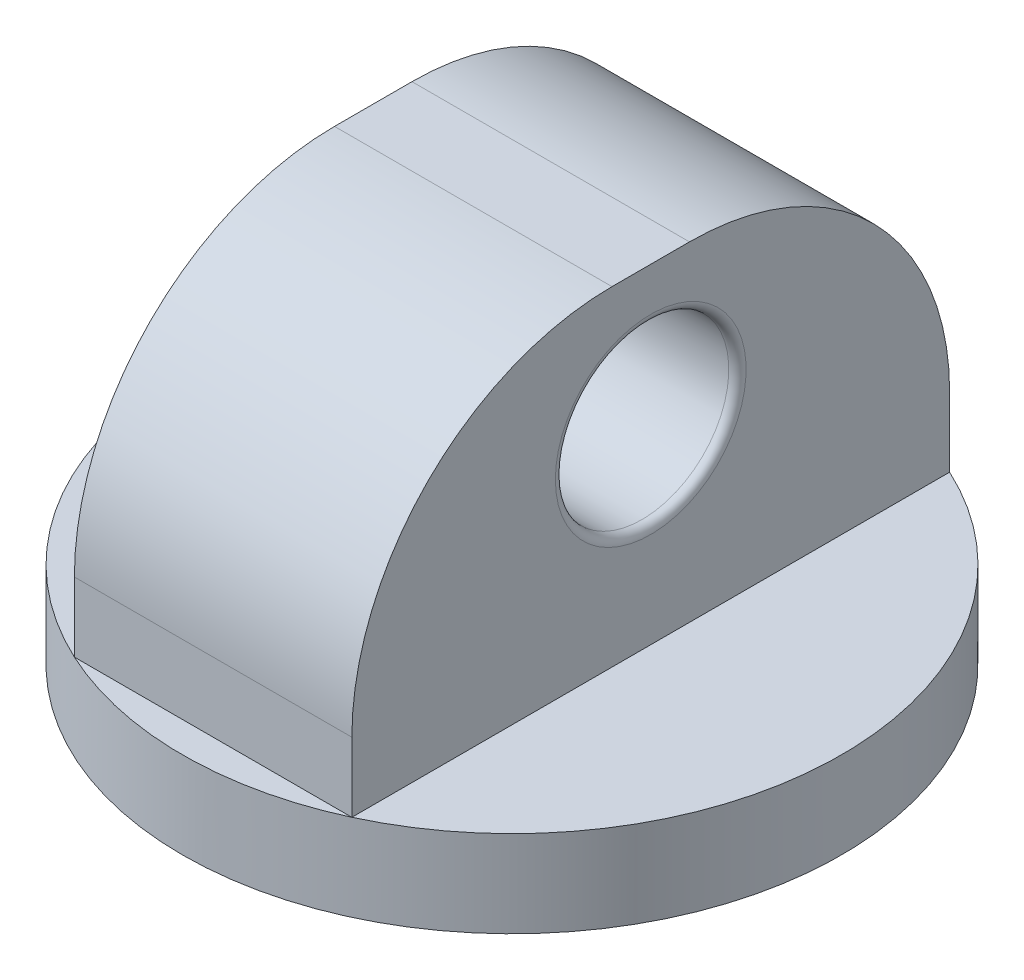
ISO-10303-21;
HEADER;
FILE_DESCRIPTION(('STEP AP214'),'2;1');
FILE_NAME('part.step','',(''),(''),'','','');
FILE_SCHEMA(('AUTOMOTIVE_DESIGN { 1 0 10303 214 1 1 1 1 }'));
ENDSEC;
DATA;
#1=APPLICATION_CONTEXT('core data for automotive mechanical design processes');
#2=APPLICATION_PROTOCOL_DEFINITION('international standard','automotive_design',2000,#1);
#3=PRODUCT_CONTEXT('',#1,'mechanical');
#4=PRODUCT('Part','Part','',(#3));
#5=PRODUCT_RELATED_PRODUCT_CATEGORY('part','',(#4));
#6=PRODUCT_DEFINITION_FORMATION('','',#4);
#7=PRODUCT_DEFINITION_CONTEXT('part definition',#1,'design');
#8=PRODUCT_DEFINITION('design','',#6,#7);
#9=PRODUCT_DEFINITION_SHAPE('','',#8);
#10=(LENGTH_UNIT() NAMED_UNIT(*) SI_UNIT(.MILLI.,.METRE.));
#11=(NAMED_UNIT(*) PLANE_ANGLE_UNIT() SI_UNIT($,.RADIAN.));
#12=(NAMED_UNIT(*) SI_UNIT($,.STERADIAN.) SOLID_ANGLE_UNIT());
#13=UNCERTAINTY_MEASURE_WITH_UNIT(LENGTH_MEASURE(1.E-05),#10,'distance_accuracy_value','');
#14=(GEOMETRIC_REPRESENTATION_CONTEXT(3) GLOBAL_UNCERTAINTY_ASSIGNED_CONTEXT((#13)) GLOBAL_UNIT_ASSIGNED_CONTEXT((#10,
#11,#12)) REPRESENTATION_CONTEXT('',''));
#15=CARTESIAN_POINT('',(0.,0.,0.));
#16=DIRECTION('',(0.,0.,1.));
#17=DIRECTION('',(1.,0.,0.));
#18=AXIS2_PLACEMENT_3D('',#15,#16,#17);
#19=CARTESIAN_POINT('',(0.,10.,0.));
#20=DIRECTION('',(0.,1.,0.));
#21=DIRECTION('',(0.,0.,1.));
#22=AXIS2_PLACEMENT_3D('',#19,#20,#21);
#23=PLANE('',#22);
#24=DIRECTION('',(0.,0.,-1.));
#25=VECTOR('',#24,1.);
#26=CARTESIAN_POINT('',(16.,10.,-34.4673758792282));
#27=LINE('',#26,#25);
#28=CARTESIAN_POINT('',(16.,10.,34.4673758792282));
#29=VERTEX_POINT('',#28);
#30=CARTESIAN_POINT('',(16.,10.,-34.4673758792282));
#31=VERTEX_POINT('',#30);
#32=EDGE_CURVE('E128',#29,#31,#27,.T.);
#33=ORIENTED_EDGE('',*,*,#32,.F.);
#34=CARTESIAN_POINT('',(0.,10.,0.));
#35=DIRECTION('',(0.,1.,0.));
#36=DIRECTION('',(0.,0.,1.));
#37=AXIS2_PLACEMENT_3D('',#34,#35,#36);
#38=CIRCLE('',#37,38.);
#39=EDGE_CURVE('E114',#29,#31,#38,.T.);
#40=ORIENTED_EDGE('',*,*,#39,.T.);
#41=EDGE_LOOP('',(#33,#40));
#42=FACE_BOUND('',#41,.T.);
#43=ADVANCED_FACE('F39',(#42),#23,.T.);
#44=DIRECTION('',(1.,0.,0.));
#45=VECTOR('',#44,1.);
#46=CARTESIAN_POINT('',(-16.,10.,34.4673758792282));
#47=LINE('',#46,#45);
#48=CARTESIAN_POINT('',(-16.,10.,34.4673758792282));
#49=VERTEX_POINT('',#48);
#50=EDGE_CURVE('E125',#49,#29,#47,.T.);
#51=ORIENTED_EDGE('',*,*,#50,.F.);
#52=EDGE_CURVE('E122',#49,#29,#38,.T.);
#53=ORIENTED_EDGE('',*,*,#52,.T.);
#54=EDGE_LOOP('',(#51,#53));
#55=FACE_BOUND('',#54,.T.);
#56=ADVANCED_FACE('F189',(#55),#23,.T.);
#57=DIRECTION('',(0.,0.,1.));
#58=VECTOR('',#57,1.);
#59=CARTESIAN_POINT('',(-16.,10.,-34.4673758792282));
#60=LINE('',#59,#58);
#61=CARTESIAN_POINT('',(-16.,10.,-34.4673758792282));
#62=VERTEX_POINT('',#61);
#63=EDGE_CURVE('E98',#62,#49,#60,.T.);
#64=ORIENTED_EDGE('',*,*,#63,.F.);
#65=EDGE_CURVE('E115',#62,#49,#38,.T.);
#66=ORIENTED_EDGE('',*,*,#65,.T.);
#67=EDGE_LOOP('',(#64,#66));
#68=FACE_BOUND('',#67,.T.);
#69=ADVANCED_FACE('F124',(#68),#23,.T.);
#70=CARTESIAN_POINT('',(0.,10.,0.));
#71=DIRECTION('',(0.,-1.,0.));
#72=DIRECTION('',(0.,0.,-1.));
#73=AXIS2_PLACEMENT_3D('',#70,#71,#72);
#74=CYLINDRICAL_SURFACE('',#73,38.);
#75=ORIENTED_EDGE('',*,*,#39,.F.);
#76=ORIENTED_EDGE('',*,*,#52,.F.);
#77=ORIENTED_EDGE('',*,*,#65,.F.);
#78=EDGE_CURVE('E107',#31,#62,#38,.T.);
#79=ORIENTED_EDGE('',*,*,#78,.F.);
#80=EDGE_LOOP('',(#75,#76,#77,#79));
#81=FACE_BOUND('',#80,.T.);
#82=CARTESIAN_POINT('',(0.,0.,0.));
#83=DIRECTION('',(0.,1.,0.));
#84=DIRECTION('',(0.,0.,1.));
#85=AXIS2_PLACEMENT_3D('',#82,#83,#84);
#86=CIRCLE('',#85,38.);
#87=CARTESIAN_POINT('',(0.,0.,38.));
#88=VERTEX_POINT('',#87);
#89=EDGE_CURVE('E141',#88,#88,#86,.T.);
#90=ORIENTED_EDGE('',*,*,#89,.T.);
#91=EDGE_LOOP('',(#90));
#92=FACE_BOUND('',#91,.T.);
#93=ADVANCED_FACE('F119',(#81,#92),#74,.T.);
#94=DIRECTION('',(-1.,0.,0.));
#95=VECTOR('',#94,1.);
#96=CARTESIAN_POINT('',(-16.,10.,-34.4673758792282));
#97=LINE('',#96,#95);
#98=EDGE_CURVE('E110',#31,#62,#97,.T.);
#99=ORIENTED_EDGE('',*,*,#98,.F.);
#100=ORIENTED_EDGE('',*,*,#78,.T.);
#101=EDGE_LOOP('',(#99,#100));
#102=FACE_BOUND('',#101,.T.);
#103=ADVANCED_FACE('F109',(#102),#23,.T.);
#104=CARTESIAN_POINT('',(0.,0.,0.));
#105=DIRECTION('',(0.,1.,0.));
#106=DIRECTION('',(0.,0.,1.));
#107=AXIS2_PLACEMENT_3D('',#104,#105,#106);
#108=PLANE('',#107);
#109=ORIENTED_EDGE('',*,*,#89,.F.);
#110=EDGE_LOOP('',(#109));
#111=FACE_BOUND('',#110,.T.);
#112=ADVANCED_FACE('F200',(#111),#108,.F.);
#113=CARTESIAN_POINT('',(16.,48.,-34.4673758792282));
#114=DIRECTION('',(-1.,0.,0.));
#115=DIRECTION('',(0.,0.,1.));
#116=AXIS2_PLACEMENT_3D('',#113,#114,#115);
#117=PLANE('',#116);
#118=CARTESIAN_POINT('',(16.,32.,0.));
#119=DIRECTION('',(-1.,0.,0.));
#120=DIRECTION('',(0.,0.,1.));
#121=AXIS2_PLACEMENT_3D('',#118,#119,#120);
#122=CIRCLE('',#121,11.);
#123=CARTESIAN_POINT('',(16.,32.,11.));
#124=VERTEX_POINT('',#123);
#125=EDGE_CURVE('E11',#124,#124,#122,.T.);
#126=ORIENTED_EDGE('',*,*,#125,.T.);
#127=EDGE_LOOP('',(#126));
#128=FACE_BOUND('',#127,.T.);
#129=DIRECTION('',(0.,-1.,0.));
#130=VECTOR('',#129,1.);
#131=CARTESIAN_POINT('',(16.,48.,-34.4673758792282));
#132=LINE('',#131,#130);
#133=CARTESIAN_POINT('',(16.,18.,-34.4673758792282));
#134=VERTEX_POINT('',#133);
#135=EDGE_CURVE('E101',#134,#31,#132,.T.);
#136=ORIENTED_EDGE('',*,*,#135,.F.);
#137=CARTESIAN_POINT('',(16.,18.,-4.46737587922818));
#138=DIRECTION('',(-1.,0.,0.));
#139=DIRECTION('',(0.,0.,1.));
#140=AXIS2_PLACEMENT_3D('',#137,#138,#139);
#141=CIRCLE('',#140,30.);
#142=CARTESIAN_POINT('',(16.,48.,-4.46737587922818));
#143=VERTEX_POINT('',#142);
#144=EDGE_CURVE('E156',#134,#143,#141,.F.);
#145=ORIENTED_EDGE('',*,*,#144,.T.);
#146=DIRECTION('',(0.,0.,-1.));
#147=VECTOR('',#146,1.);
#148=CARTESIAN_POINT('',(16.,48.,-34.4673758792282));
#149=LINE('',#148,#147);
#150=CARTESIAN_POINT('',(16.,48.,4.46737587922818));
#151=VERTEX_POINT('',#150);
#152=EDGE_CURVE('E136',#151,#143,#149,.T.);
#153=ORIENTED_EDGE('',*,*,#152,.F.);
#154=CARTESIAN_POINT('',(16.,18.,4.46737587922818));
#155=DIRECTION('',(-1.,0.,0.));
#156=DIRECTION('',(0.,0.,1.));
#157=AXIS2_PLACEMENT_3D('',#154,#155,#156);
#158=CIRCLE('',#157,30.);
#159=CARTESIAN_POINT('',(16.,18.,34.4673758792282));
#160=VERTEX_POINT('',#159);
#161=EDGE_CURVE('E54',#151,#160,#158,.F.);
#162=ORIENTED_EDGE('',*,*,#161,.T.);
#163=DIRECTION('',(0.,-1.,0.));
#164=VECTOR('',#163,1.);
#165=CARTESIAN_POINT('',(16.,48.,34.4673758792282));
#166=LINE('',#165,#164);
#167=EDGE_CURVE('E137',#160,#29,#166,.T.);
#168=ORIENTED_EDGE('',*,*,#167,.T.);
#169=ORIENTED_EDGE('',*,*,#32,.T.);
#170=EDGE_LOOP('',(#136,#145,#153,#162,#168,#169));
#171=FACE_BOUND('',#170,.T.);
#172=ADVANCED_FACE('F205',(#128,#171),#117,.F.);
#173=CARTESIAN_POINT('',(-16.,48.,-34.4673758792282));
#174=DIRECTION('',(0.,0.,1.));
#175=DIRECTION('',(1.,0.,0.));
#176=AXIS2_PLACEMENT_3D('',#173,#174,#175);
#177=PLANE('',#176);
#178=DIRECTION('',(0.,-1.,0.));
#179=VECTOR('',#178,1.);
#180=CARTESIAN_POINT('',(-16.,48.,-34.4673758792282));
#181=LINE('',#180,#179);
#182=CARTESIAN_POINT('',(-16.,18.,-34.4673758792282));
#183=VERTEX_POINT('',#182);
#184=EDGE_CURVE('E92',#183,#62,#181,.T.);
#185=ORIENTED_EDGE('',*,*,#184,.F.);
#186=DIRECTION('',(-1.,0.,0.));
#187=VECTOR('',#186,1.);
#188=CARTESIAN_POINT('',(16.,18.,-34.4673758792282));
#189=LINE('',#188,#187);
#190=EDGE_CURVE('E62',#183,#134,#189,.F.);
#191=ORIENTED_EDGE('',*,*,#190,.T.);
#192=ORIENTED_EDGE('',*,*,#135,.T.);
#193=ORIENTED_EDGE('',*,*,#98,.T.);
#194=EDGE_LOOP('',(#185,#191,#192,#193));
#195=FACE_BOUND('',#194,.T.);
#196=ADVANCED_FACE('F127',(#195),#177,.F.);
#197=CARTESIAN_POINT('',(-16.,48.,-34.4673758792282));
#198=DIRECTION('',(1.,0.,0.));
#199=DIRECTION('',(0.,0.,-1.));
#200=AXIS2_PLACEMENT_3D('',#197,#198,#199);
#201=PLANE('',#200);
#202=CARTESIAN_POINT('',(-16.,32.,0.));
#203=DIRECTION('',(1.,0.,0.));
#204=DIRECTION('',(0.,0.,-1.));
#205=AXIS2_PLACEMENT_3D('',#202,#203,#204);
#206=CIRCLE('',#205,11.);
#207=CARTESIAN_POINT('',(-16.,32.,-11.));
#208=VERTEX_POINT('',#207);
#209=EDGE_CURVE('E47',#208,#208,#206,.T.);
#210=ORIENTED_EDGE('',*,*,#209,.T.);
#211=EDGE_LOOP('',(#210));
#212=FACE_BOUND('',#211,.T.);
#213=DIRECTION('',(0.,0.,1.));
#214=VECTOR('',#213,1.);
#215=CARTESIAN_POINT('',(-16.,48.,-34.4673758792282));
#216=LINE('',#215,#214);
#217=CARTESIAN_POINT('',(-16.,48.,-4.46737587922818));
#218=VERTEX_POINT('',#217);
#219=CARTESIAN_POINT('',(-16.,48.,4.46737587922818));
#220=VERTEX_POINT('',#219);
#221=EDGE_CURVE('E139',#218,#220,#216,.T.);
#222=ORIENTED_EDGE('',*,*,#221,.F.);
#223=CARTESIAN_POINT('',(-16.,18.,-4.46737587922818));
#224=DIRECTION('',(1.,0.,0.));
#225=DIRECTION('',(0.,0.,-1.));
#226=AXIS2_PLACEMENT_3D('',#223,#224,#225);
#227=CIRCLE('',#226,30.);
#228=EDGE_CURVE('E99',#218,#183,#227,.F.);
#229=ORIENTED_EDGE('',*,*,#228,.T.);
#230=ORIENTED_EDGE('',*,*,#184,.T.);
#231=ORIENTED_EDGE('',*,*,#63,.T.);
#232=DIRECTION('',(0.,-1.,0.));
#233=VECTOR('',#232,1.);
#234=CARTESIAN_POINT('',(-16.,48.,34.4673758792282));
#235=LINE('',#234,#233);
#236=CARTESIAN_POINT('',(-16.,18.,34.4673758792282));
#237=VERTEX_POINT('',#236);
#238=EDGE_CURVE('E102',#237,#49,#235,.T.);
#239=ORIENTED_EDGE('',*,*,#238,.F.);
#240=CARTESIAN_POINT('',(-16.,18.,4.46737587922818));
#241=DIRECTION('',(1.,0.,0.));
#242=DIRECTION('',(0.,0.,-1.));
#243=AXIS2_PLACEMENT_3D('',#240,#241,#242);
#244=CIRCLE('',#243,30.);
#245=EDGE_CURVE('E151',#237,#220,#244,.F.);
#246=ORIENTED_EDGE('',*,*,#245,.T.);
#247=EDGE_LOOP('',(#222,#229,#230,#231,#239,#246));
#248=FACE_BOUND('',#247,.T.);
#249=ADVANCED_FACE('F95',(#212,#248),#201,.F.);
#250=CARTESIAN_POINT('',(-16.,48.,34.4673758792282));
#251=DIRECTION('',(0.,0.,-1.));
#252=DIRECTION('',(-1.,0.,0.));
#253=AXIS2_PLACEMENT_3D('',#250,#251,#252);
#254=PLANE('',#253);
#255=ORIENTED_EDGE('',*,*,#167,.F.);
#256=DIRECTION('',(1.,0.,0.));
#257=VECTOR('',#256,1.);
#258=CARTESIAN_POINT('',(-16.,18.,34.4673758792282));
#259=LINE('',#258,#257);
#260=EDGE_CURVE('E158',#160,#237,#259,.F.);
#261=ORIENTED_EDGE('',*,*,#260,.T.);
#262=ORIENTED_EDGE('',*,*,#238,.T.);
#263=ORIENTED_EDGE('',*,*,#50,.T.);
#264=EDGE_LOOP('',(#255,#261,#262,#263));
#265=FACE_BOUND('',#264,.T.);
#266=ADVANCED_FACE('F239',(#265),#254,.F.);
#267=CARTESIAN_POINT('',(0.,48.,0.));
#268=DIRECTION('',(0.,1.,0.));
#269=DIRECTION('',(0.,0.,1.));
#270=AXIS2_PLACEMENT_3D('',#267,#268,#269);
#271=PLANE('',#270);
#272=ORIENTED_EDGE('',*,*,#152,.T.);
#273=DIRECTION('',(-1.,0.,0.));
#274=VECTOR('',#273,1.);
#275=CARTESIAN_POINT('',(-16.,48.,-4.46737587922818));
#276=LINE('',#275,#274);
#277=EDGE_CURVE('E148',#143,#218,#276,.T.);
#278=ORIENTED_EDGE('',*,*,#277,.T.);
#279=ORIENTED_EDGE('',*,*,#221,.T.);
#280=DIRECTION('',(1.,0.,0.));
#281=VECTOR('',#280,1.);
#282=CARTESIAN_POINT('',(16.,48.,4.46737587922818));
#283=LINE('',#282,#281);
#284=EDGE_CURVE('E143',#220,#151,#283,.T.);
#285=ORIENTED_EDGE('',*,*,#284,.T.);
#286=EDGE_LOOP('',(#272,#278,#279,#285));
#287=FACE_BOUND('',#286,.T.);
#288=ADVANCED_FACE('F179',(#287),#271,.T.);
#289=CARTESIAN_POINT('',(38.,32.,0.));
#290=DIRECTION('',(-1.,0.,0.));
#291=DIRECTION('',(0.,0.,1.));
#292=AXIS2_PLACEMENT_3D('',#289,#290,#291);
#293=CYLINDRICAL_SURFACE('',#292,10.);
#294=CARTESIAN_POINT('',(-15.,32.,0.));
#295=DIRECTION('',(1.,0.,0.));
#296=DIRECTION('',(0.,0.,-1.));
#297=AXIS2_PLACEMENT_3D('',#294,#295,#296);
#298=CIRCLE('',#297,10.);
#299=CARTESIAN_POINT('',(-15.,32.,-10.));
#300=VERTEX_POINT('',#299);
#301=EDGE_CURVE('E163',#300,#300,#298,.F.);
#302=ORIENTED_EDGE('',*,*,#301,.T.);
#303=EDGE_LOOP('',(#302));
#304=FACE_BOUND('',#303,.T.);
#305=CARTESIAN_POINT('',(15.,32.,0.));
#306=DIRECTION('',(-1.,0.,0.));
#307=DIRECTION('',(0.,0.,1.));
#308=AXIS2_PLACEMENT_3D('',#305,#306,#307);
#309=CIRCLE('',#308,10.);
#310=CARTESIAN_POINT('',(15.,32.,10.));
#311=VERTEX_POINT('',#310);
#312=EDGE_CURVE('E160',#311,#311,#309,.F.);
#313=ORIENTED_EDGE('',*,*,#312,.T.);
#314=EDGE_LOOP('',(#313));
#315=FACE_BOUND('',#314,.T.);
#316=ADVANCED_FACE('F175',(#304,#315),#293,.F.);
#317=CARTESIAN_POINT('',(0.,18.,-4.46737587922818));
#318=DIRECTION('',(1.,0.,0.));
#319=DIRECTION('',(0.,0.,-1.));
#320=AXIS2_PLACEMENT_3D('',#317,#318,#319);
#321=CYLINDRICAL_SURFACE('',#320,30.);
#322=ORIENTED_EDGE('',*,*,#144,.F.);
#323=ORIENTED_EDGE('',*,*,#190,.F.);
#324=ORIENTED_EDGE('',*,*,#228,.F.);
#325=ORIENTED_EDGE('',*,*,#277,.F.);
#326=EDGE_LOOP('',(#322,#323,#324,#325));
#327=FACE_BOUND('',#326,.T.);
#328=ADVANCED_FACE('F178',(#327),#321,.T.);
#329=CARTESIAN_POINT('',(0.,18.,4.46737587922818));
#330=DIRECTION('',(-1.,0.,0.));
#331=DIRECTION('',(0.,0.,1.));
#332=AXIS2_PLACEMENT_3D('',#329,#330,#331);
#333=CYLINDRICAL_SURFACE('',#332,30.);
#334=ORIENTED_EDGE('',*,*,#245,.F.);
#335=ORIENTED_EDGE('',*,*,#260,.F.);
#336=ORIENTED_EDGE('',*,*,#161,.F.);
#337=ORIENTED_EDGE('',*,*,#284,.F.);
#338=EDGE_LOOP('',(#334,#335,#336,#337));
#339=FACE_BOUND('',#338,.T.);
#340=ADVANCED_FACE('F172',(#339),#333,.T.);
#341=CARTESIAN_POINT('',(-15.,32.,0.));
#342=DIRECTION('',(1.,0.,0.));
#343=DIRECTION('',(0.,0.,-1.));
#344=AXIS2_PLACEMENT_3D('',#341,#342,#343);
#345=TOROIDAL_SURFACE('',#344,11.,1.);
#346=ORIENTED_EDGE('',*,*,#209,.F.);
#347=EDGE_LOOP('',(#346));
#348=FACE_BOUND('',#347,.T.);
#349=ORIENTED_EDGE('',*,*,#301,.F.);
#350=EDGE_LOOP('',(#349));
#351=FACE_BOUND('',#350,.T.);
#352=ADVANCED_FACE('F169',(#348,#351),#345,.T.);
#353=CARTESIAN_POINT('',(15.,32.,0.));
#354=DIRECTION('',(-1.,0.,0.));
#355=DIRECTION('',(0.,0.,1.));
#356=AXIS2_PLACEMENT_3D('',#353,#354,#355);
#357=TOROIDAL_SURFACE('',#356,11.,1.);
#358=ORIENTED_EDGE('',*,*,#125,.F.);
#359=EDGE_LOOP('',(#358));
#360=FACE_BOUND('',#359,.T.);
#361=ORIENTED_EDGE('',*,*,#312,.F.);
#362=EDGE_LOOP('',(#361));
#363=FACE_BOUND('',#362,.T.);
#364=ADVANCED_FACE('F41',(#360,#363),#357,.T.);
#365=CLOSED_SHELL('',(#43,#56,#69,#93,#103,#112,#172,#196,#249,#266,#288,#316,#328,#340,#352,#364));
#366=MANIFOLD_SOLID_BREP('B2',#365);
#367=ADVANCED_BREP_SHAPE_REPRESENTATION('',(#18,#366),#14);
#368=SHAPE_DEFINITION_REPRESENTATION(#9,#367);
ENDSEC;
END-ISO-10303-21;
